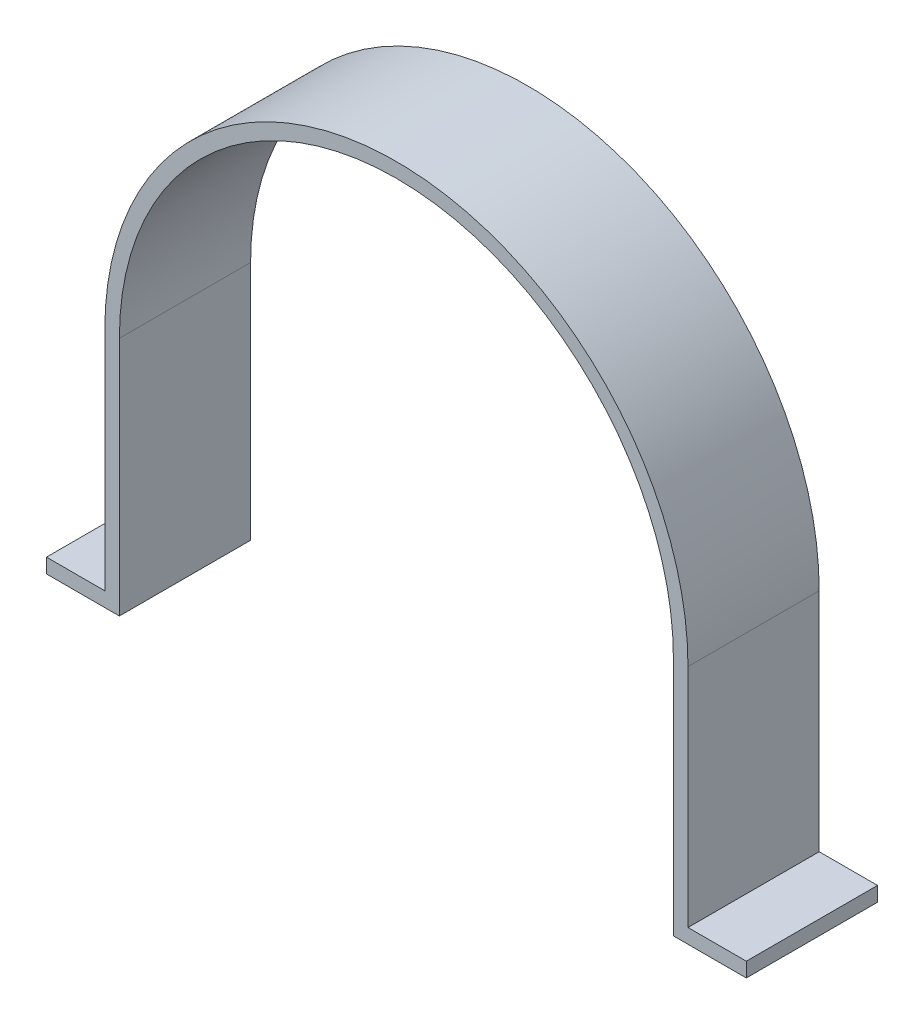
ISO-10303-21;
HEADER;
FILE_DESCRIPTION(('STEP AP214'),'2;1');
FILE_NAME('part.step','',(''),(''),'','','');
FILE_SCHEMA(('AUTOMOTIVE_DESIGN { 1 0 10303 214 1 1 1 1 }'));
ENDSEC;
DATA;
#1=APPLICATION_CONTEXT('core data for automotive mechanical design processes');
#2=APPLICATION_PROTOCOL_DEFINITION('international standard','automotive_design',2000,#1);
#3=PRODUCT_CONTEXT('',#1,'mechanical');
#4=PRODUCT('Part','Part','',(#3));
#5=PRODUCT_RELATED_PRODUCT_CATEGORY('part','',(#4));
#6=PRODUCT_DEFINITION_FORMATION('','',#4);
#7=PRODUCT_DEFINITION_CONTEXT('part definition',#1,'design');
#8=PRODUCT_DEFINITION('design','',#6,#7);
#9=PRODUCT_DEFINITION_SHAPE('','',#8);
#10=(LENGTH_UNIT() NAMED_UNIT(*) SI_UNIT(.MILLI.,.METRE.));
#11=(NAMED_UNIT(*) PLANE_ANGLE_UNIT() SI_UNIT($,.RADIAN.));
#12=(NAMED_UNIT(*) SI_UNIT($,.STERADIAN.) SOLID_ANGLE_UNIT());
#13=UNCERTAINTY_MEASURE_WITH_UNIT(LENGTH_MEASURE(1.E-05),#10,'distance_accuracy_value','');
#14=(GEOMETRIC_REPRESENTATION_CONTEXT(3) GLOBAL_UNCERTAINTY_ASSIGNED_CONTEXT((#13)) GLOBAL_UNIT_ASSIGNED_CONTEXT((#10,
#11,#12)) REPRESENTATION_CONTEXT('',''));
#15=CARTESIAN_POINT('',(0.,0.,0.));
#16=DIRECTION('',(0.,0.,1.));
#17=DIRECTION('',(1.,0.,0.));
#18=AXIS2_PLACEMENT_3D('',#15,#16,#17);
#19=CARTESIAN_POINT('',(0.,28.5,9.));
#20=DIRECTION('',(0.,0.,-1.));
#21=DIRECTION('',(-1.,0.,0.));
#22=AXIS2_PLACEMENT_3D('',#19,#20,#21);
#23=CYLINDRICAL_SURFACE('',#22,19.);
#24=CARTESIAN_POINT('',(0.,28.5,0.));
#25=DIRECTION('',(0.,0.,-1.));
#26=DIRECTION('',(-1.,0.,0.));
#27=AXIS2_PLACEMENT_3D('',#24,#25,#26);
#28=CIRCLE('',#27,19.);
#29=CARTESIAN_POINT('',(-19.,28.5,0.));
#30=VERTEX_POINT('',#29);
#31=CARTESIAN_POINT('',(19.,28.5,0.));
#32=VERTEX_POINT('',#31);
#33=EDGE_CURVE('E172',#30,#32,#28,.T.);
#34=ORIENTED_EDGE('',*,*,#33,.T.);
#35=DIRECTION('',(0.,0.,-1.));
#36=VECTOR('',#35,1.);
#37=CARTESIAN_POINT('',(19.,28.5,9.));
#38=LINE('',#37,#36);
#39=CARTESIAN_POINT('',(19.,28.5,9.));
#40=VERTEX_POINT('',#39);
#41=EDGE_CURVE('E11',#40,#32,#38,.T.);
#42=ORIENTED_EDGE('',*,*,#41,.F.);
#43=CARTESIAN_POINT('',(0.,28.5,9.));
#44=DIRECTION('',(0.,0.,-1.));
#45=DIRECTION('',(-1.,0.,0.));
#46=AXIS2_PLACEMENT_3D('',#43,#44,#45);
#47=CIRCLE('',#46,19.);
#48=CARTESIAN_POINT('',(-19.,28.5,9.));
#49=VERTEX_POINT('',#48);
#50=EDGE_CURVE('E206',#49,#40,#47,.T.);
#51=ORIENTED_EDGE('',*,*,#50,.F.);
#52=DIRECTION('',(0.,0.,-1.));
#53=VECTOR('',#52,1.);
#54=CARTESIAN_POINT('',(-19.,28.5,9.));
#55=LINE('',#54,#53);
#56=EDGE_CURVE('E168',#49,#30,#55,.T.);
#57=ORIENTED_EDGE('',*,*,#56,.T.);
#58=EDGE_LOOP('',(#34,#42,#51,#57));
#59=FACE_BOUND('',#58,.T.);
#60=ADVANCED_FACE('F45',(#59),#23,.F.);
#61=CARTESIAN_POINT('',(19.,28.5,9.));
#62=DIRECTION('',(1.,0.,0.));
#63=DIRECTION('',(0.,0.,-1.));
#64=AXIS2_PLACEMENT_3D('',#61,#62,#63);
#65=PLANE('',#64);
#66=DIRECTION('',(0.,-1.,0.));
#67=VECTOR('',#66,1.);
#68=CARTESIAN_POINT('',(19.,28.5,0.));
#69=LINE('',#68,#67);
#70=CARTESIAN_POINT('',(19.,12.,0.));
#71=VERTEX_POINT('',#70);
#72=EDGE_CURVE('E176',#32,#71,#69,.T.);
#73=ORIENTED_EDGE('',*,*,#72,.T.);
#74=DIRECTION('',(0.,0.,-1.));
#75=VECTOR('',#74,1.);
#76=CARTESIAN_POINT('',(19.,12.,9.));
#77=LINE('',#76,#75);
#78=CARTESIAN_POINT('',(19.,12.,9.));
#79=VERTEX_POINT('',#78);
#80=EDGE_CURVE('E54',#79,#71,#77,.T.);
#81=ORIENTED_EDGE('',*,*,#80,.F.);
#82=DIRECTION('',(0.,-1.,0.));
#83=VECTOR('',#82,1.);
#84=CARTESIAN_POINT('',(19.,28.5,9.));
#85=LINE('',#84,#83);
#86=EDGE_CURVE('E117',#40,#79,#85,.T.);
#87=ORIENTED_EDGE('',*,*,#86,.F.);
#88=ORIENTED_EDGE('',*,*,#41,.T.);
#89=EDGE_LOOP('',(#73,#81,#87,#88));
#90=FACE_BOUND('',#89,.T.);
#91=ADVANCED_FACE('F282',(#90),#65,.F.);
#92=CARTESIAN_POINT('',(19.,12.,9.));
#93=DIRECTION('',(0.,1.,0.));
#94=DIRECTION('',(0.,0.,1.));
#95=AXIS2_PLACEMENT_3D('',#92,#93,#94);
#96=PLANE('',#95);
#97=DIRECTION('',(1.,0.,0.));
#98=VECTOR('',#97,1.);
#99=CARTESIAN_POINT('',(19.,12.,0.));
#100=LINE('',#99,#98);
#101=CARTESIAN_POINT('',(24.,12.,0.));
#102=VERTEX_POINT('',#101);
#103=EDGE_CURVE('E179',#71,#102,#100,.T.);
#104=ORIENTED_EDGE('',*,*,#103,.T.);
#105=DIRECTION('',(0.,0.,-1.));
#106=VECTOR('',#105,1.);
#107=CARTESIAN_POINT('',(24.,12.,9.));
#108=LINE('',#107,#106);
#109=CARTESIAN_POINT('',(24.,12.,9.));
#110=VERTEX_POINT('',#109);
#111=EDGE_CURVE('E232',#110,#102,#108,.T.);
#112=ORIENTED_EDGE('',*,*,#111,.F.);
#113=DIRECTION('',(1.,0.,0.));
#114=VECTOR('',#113,1.);
#115=CARTESIAN_POINT('',(19.,12.,9.));
#116=LINE('',#115,#114);
#117=EDGE_CURVE('E242',#79,#110,#116,.T.);
#118=ORIENTED_EDGE('',*,*,#117,.F.);
#119=ORIENTED_EDGE('',*,*,#80,.T.);
#120=EDGE_LOOP('',(#104,#112,#118,#119));
#121=FACE_BOUND('',#120,.T.);
#122=ADVANCED_FACE('F240',(#121),#96,.F.);
#123=CARTESIAN_POINT('',(24.,12.,9.));
#124=DIRECTION('',(-1.,0.,0.));
#125=DIRECTION('',(0.,0.,1.));
#126=AXIS2_PLACEMENT_3D('',#123,#124,#125);
#127=PLANE('',#126);
#128=DIRECTION('',(0.,1.,0.));
#129=VECTOR('',#128,1.);
#130=CARTESIAN_POINT('',(24.,12.,0.));
#131=LINE('',#130,#129);
#132=CARTESIAN_POINT('',(24.,13.,0.));
#133=VERTEX_POINT('',#132);
#134=EDGE_CURVE('E182',#102,#133,#131,.T.);
#135=ORIENTED_EDGE('',*,*,#134,.T.);
#136=DIRECTION('',(0.,0.,-1.));
#137=VECTOR('',#136,1.);
#138=CARTESIAN_POINT('',(24.,13.,9.));
#139=LINE('',#138,#137);
#140=CARTESIAN_POINT('',(24.,13.,9.));
#141=VERTEX_POINT('',#140);
#142=EDGE_CURVE('E228',#141,#133,#139,.T.);
#143=ORIENTED_EDGE('',*,*,#142,.F.);
#144=DIRECTION('',(0.,1.,0.));
#145=VECTOR('',#144,1.);
#146=CARTESIAN_POINT('',(24.,12.,9.));
#147=LINE('',#146,#145);
#148=EDGE_CURVE('E261',#110,#141,#147,.T.);
#149=ORIENTED_EDGE('',*,*,#148,.F.);
#150=ORIENTED_EDGE('',*,*,#111,.T.);
#151=EDGE_LOOP('',(#135,#143,#149,#150));
#152=FACE_BOUND('',#151,.T.);
#153=ADVANCED_FACE('F251',(#152),#127,.F.);
#154=CARTESIAN_POINT('',(24.,13.,9.));
#155=DIRECTION('',(0.,-1.,0.));
#156=DIRECTION('',(0.,0.,-1.));
#157=AXIS2_PLACEMENT_3D('',#154,#155,#156);
#158=PLANE('',#157);
#159=DIRECTION('',(-1.,0.,0.));
#160=VECTOR('',#159,1.);
#161=CARTESIAN_POINT('',(24.,13.,0.));
#162=LINE('',#161,#160);
#163=CARTESIAN_POINT('',(20.,13.,0.));
#164=VERTEX_POINT('',#163);
#165=EDGE_CURVE('E185',#133,#164,#162,.T.);
#166=ORIENTED_EDGE('',*,*,#165,.T.);
#167=DIRECTION('',(0.,0.,-1.));
#168=VECTOR('',#167,1.);
#169=CARTESIAN_POINT('',(20.,13.,9.));
#170=LINE('',#169,#168);
#171=CARTESIAN_POINT('',(20.,13.,9.));
#172=VERTEX_POINT('',#171);
#173=EDGE_CURVE('E225',#172,#164,#170,.T.);
#174=ORIENTED_EDGE('',*,*,#173,.F.);
#175=DIRECTION('',(-1.,0.,0.));
#176=VECTOR('',#175,1.);
#177=CARTESIAN_POINT('',(24.,13.,9.));
#178=LINE('',#177,#176);
#179=EDGE_CURVE('E257',#141,#172,#178,.T.);
#180=ORIENTED_EDGE('',*,*,#179,.F.);
#181=ORIENTED_EDGE('',*,*,#142,.T.);
#182=EDGE_LOOP('',(#166,#174,#180,#181));
#183=FACE_BOUND('',#182,.T.);
#184=ADVANCED_FACE('F255',(#183),#158,.F.);
#185=CARTESIAN_POINT('',(20.,13.,9.));
#186=DIRECTION('',(-1.,0.,0.));
#187=DIRECTION('',(0.,0.,1.));
#188=AXIS2_PLACEMENT_3D('',#185,#186,#187);
#189=PLANE('',#188);
#190=DIRECTION('',(0.,1.,0.));
#191=VECTOR('',#190,1.);
#192=CARTESIAN_POINT('',(20.,13.,0.));
#193=LINE('',#192,#191);
#194=CARTESIAN_POINT('',(20.,28.5,0.));
#195=VERTEX_POINT('',#194);
#196=EDGE_CURVE('E188',#164,#195,#193,.T.);
#197=ORIENTED_EDGE('',*,*,#196,.T.);
#198=DIRECTION('',(0.,0.,-1.));
#199=VECTOR('',#198,1.);
#200=CARTESIAN_POINT('',(20.,28.5,9.));
#201=LINE('',#200,#199);
#202=CARTESIAN_POINT('',(20.,28.5,9.));
#203=VERTEX_POINT('',#202);
#204=EDGE_CURVE('E221',#203,#195,#201,.T.);
#205=ORIENTED_EDGE('',*,*,#204,.F.);
#206=DIRECTION('',(0.,1.,0.));
#207=VECTOR('',#206,1.);
#208=CARTESIAN_POINT('',(20.,13.,9.));
#209=LINE('',#208,#207);
#210=EDGE_CURVE('E260',#172,#203,#209,.T.);
#211=ORIENTED_EDGE('',*,*,#210,.F.);
#212=ORIENTED_EDGE('',*,*,#173,.T.);
#213=EDGE_LOOP('',(#197,#205,#211,#212));
#214=FACE_BOUND('',#213,.T.);
#215=ADVANCED_FACE('F293',(#214),#189,.F.);
#216=CARTESIAN_POINT('',(0.,28.5,9.));
#217=DIRECTION('',(0.,0.,-1.));
#218=DIRECTION('',(-1.,0.,0.));
#219=AXIS2_PLACEMENT_3D('',#216,#217,#218);
#220=CYLINDRICAL_SURFACE('',#219,20.);
#221=CARTESIAN_POINT('',(0.,28.5,0.));
#222=DIRECTION('',(0.,0.,1.));
#223=DIRECTION('',(1.,0.,0.));
#224=AXIS2_PLACEMENT_3D('',#221,#222,#223);
#225=CIRCLE('',#224,20.);
#226=CARTESIAN_POINT('',(-20.,28.5,0.));
#227=VERTEX_POINT('',#226);
#228=EDGE_CURVE('E191',#195,#227,#225,.T.);
#229=ORIENTED_EDGE('',*,*,#228,.T.);
#230=DIRECTION('',(0.,0.,-1.));
#231=VECTOR('',#230,1.);
#232=CARTESIAN_POINT('',(-20.,28.5,9.));
#233=LINE('',#232,#231);
#234=CARTESIAN_POINT('',(-20.,28.5,9.));
#235=VERTEX_POINT('',#234);
#236=EDGE_CURVE('E217',#235,#227,#233,.T.);
#237=ORIENTED_EDGE('',*,*,#236,.F.);
#238=CARTESIAN_POINT('',(0.,28.5,9.));
#239=DIRECTION('',(0.,0.,1.));
#240=DIRECTION('',(1.,0.,0.));
#241=AXIS2_PLACEMENT_3D('',#238,#239,#240);
#242=CIRCLE('',#241,20.);
#243=EDGE_CURVE('E264',#203,#235,#242,.T.);
#244=ORIENTED_EDGE('',*,*,#243,.F.);
#245=ORIENTED_EDGE('',*,*,#204,.T.);
#246=EDGE_LOOP('',(#229,#237,#244,#245));
#247=FACE_BOUND('',#246,.T.);
#248=ADVANCED_FACE('F296',(#247),#220,.T.);
#249=CARTESIAN_POINT('',(-20.,28.5,9.));
#250=DIRECTION('',(1.,0.,0.));
#251=DIRECTION('',(0.,0.,-1.));
#252=AXIS2_PLACEMENT_3D('',#249,#250,#251);
#253=PLANE('',#252);
#254=DIRECTION('',(0.,-1.,0.));
#255=VECTOR('',#254,1.);
#256=CARTESIAN_POINT('',(-20.,28.5,0.));
#257=LINE('',#256,#255);
#258=CARTESIAN_POINT('',(-20.,13.,0.));
#259=VERTEX_POINT('',#258);
#260=EDGE_CURVE('E194',#227,#259,#257,.T.);
#261=ORIENTED_EDGE('',*,*,#260,.T.);
#262=DIRECTION('',(0.,0.,-1.));
#263=VECTOR('',#262,1.);
#264=CARTESIAN_POINT('',(-20.,13.,9.));
#265=LINE('',#264,#263);
#266=CARTESIAN_POINT('',(-20.,13.,9.));
#267=VERTEX_POINT('',#266);
#268=EDGE_CURVE('E213',#267,#259,#265,.T.);
#269=ORIENTED_EDGE('',*,*,#268,.F.);
#270=DIRECTION('',(0.,-1.,0.));
#271=VECTOR('',#270,1.);
#272=CARTESIAN_POINT('',(-20.,28.5,9.));
#273=LINE('',#272,#271);
#274=EDGE_CURVE('E272',#235,#267,#273,.T.);
#275=ORIENTED_EDGE('',*,*,#274,.F.);
#276=ORIENTED_EDGE('',*,*,#236,.T.);
#277=EDGE_LOOP('',(#261,#269,#275,#276));
#278=FACE_BOUND('',#277,.T.);
#279=ADVANCED_FACE('F300',(#278),#253,.F.);
#280=CARTESIAN_POINT('',(-20.,13.,9.));
#281=DIRECTION('',(0.,-1.,0.));
#282=DIRECTION('',(0.,0.,-1.));
#283=AXIS2_PLACEMENT_3D('',#280,#281,#282);
#284=PLANE('',#283);
#285=DIRECTION('',(-1.,0.,0.));
#286=VECTOR('',#285,1.);
#287=CARTESIAN_POINT('',(-20.,13.,0.));
#288=LINE('',#287,#286);
#289=CARTESIAN_POINT('',(-24.,13.,0.));
#290=VERTEX_POINT('',#289);
#291=EDGE_CURVE('E197',#259,#290,#288,.T.);
#292=ORIENTED_EDGE('',*,*,#291,.T.);
#293=DIRECTION('',(0.,0.,-1.));
#294=VECTOR('',#293,1.);
#295=CARTESIAN_POINT('',(-24.,13.,9.));
#296=LINE('',#295,#294);
#297=CARTESIAN_POINT('',(-24.,13.,9.));
#298=VERTEX_POINT('',#297);
#299=EDGE_CURVE('E159',#298,#290,#296,.T.);
#300=ORIENTED_EDGE('',*,*,#299,.F.);
#301=DIRECTION('',(-1.,0.,0.));
#302=VECTOR('',#301,1.);
#303=CARTESIAN_POINT('',(-20.,13.,9.));
#304=LINE('',#303,#302);
#305=EDGE_CURVE('E148',#267,#298,#304,.T.);
#306=ORIENTED_EDGE('',*,*,#305,.F.);
#307=ORIENTED_EDGE('',*,*,#268,.T.);
#308=EDGE_LOOP('',(#292,#300,#306,#307));
#309=FACE_BOUND('',#308,.T.);
#310=ADVANCED_FACE('F304',(#309),#284,.F.);
#311=CARTESIAN_POINT('',(-24.,13.,9.));
#312=DIRECTION('',(1.,0.,0.));
#313=DIRECTION('',(0.,0.,-1.));
#314=AXIS2_PLACEMENT_3D('',#311,#312,#313);
#315=PLANE('',#314);
#316=DIRECTION('',(0.,-1.,0.));
#317=VECTOR('',#316,1.);
#318=CARTESIAN_POINT('',(-24.,13.,0.));
#319=LINE('',#318,#317);
#320=CARTESIAN_POINT('',(-24.,12.,0.));
#321=VERTEX_POINT('',#320);
#322=EDGE_CURVE('E157',#290,#321,#319,.T.);
#323=ORIENTED_EDGE('',*,*,#322,.T.);
#324=DIRECTION('',(0.,0.,-1.));
#325=VECTOR('',#324,1.);
#326=CARTESIAN_POINT('',(-24.,12.,9.));
#327=LINE('',#326,#325);
#328=CARTESIAN_POINT('',(-24.,12.,9.));
#329=VERTEX_POINT('',#328);
#330=EDGE_CURVE('E154',#329,#321,#327,.T.);
#331=ORIENTED_EDGE('',*,*,#330,.F.);
#332=DIRECTION('',(0.,-1.,0.));
#333=VECTOR('',#332,1.);
#334=CARTESIAN_POINT('',(-24.,13.,9.));
#335=LINE('',#334,#333);
#336=EDGE_CURVE('E142',#298,#329,#335,.T.);
#337=ORIENTED_EDGE('',*,*,#336,.F.);
#338=ORIENTED_EDGE('',*,*,#299,.T.);
#339=EDGE_LOOP('',(#323,#331,#337,#338));
#340=FACE_BOUND('',#339,.T.);
#341=ADVANCED_FACE('F155',(#340),#315,.F.);
#342=CARTESIAN_POINT('',(-24.,12.,9.));
#343=DIRECTION('',(0.,1.,0.));
#344=DIRECTION('',(0.,0.,1.));
#345=AXIS2_PLACEMENT_3D('',#342,#343,#344);
#346=PLANE('',#345);
#347=DIRECTION('',(1.,0.,0.));
#348=VECTOR('',#347,1.);
#349=CARTESIAN_POINT('',(-24.,12.,0.));
#350=LINE('',#349,#348);
#351=CARTESIAN_POINT('',(-19.,12.,0.));
#352=VERTEX_POINT('',#351);
#353=EDGE_CURVE('E103',#321,#352,#350,.T.);
#354=ORIENTED_EDGE('',*,*,#353,.T.);
#355=DIRECTION('',(0.,0.,-1.));
#356=VECTOR('',#355,1.);
#357=CARTESIAN_POINT('',(-19.,12.,9.));
#358=LINE('',#357,#356);
#359=CARTESIAN_POINT('',(-19.,12.,9.));
#360=VERTEX_POINT('',#359);
#361=EDGE_CURVE('E160',#360,#352,#358,.T.);
#362=ORIENTED_EDGE('',*,*,#361,.F.);
#363=DIRECTION('',(1.,0.,0.));
#364=VECTOR('',#363,1.);
#365=CARTESIAN_POINT('',(-24.,12.,9.));
#366=LINE('',#365,#364);
#367=EDGE_CURVE('E146',#329,#360,#366,.T.);
#368=ORIENTED_EDGE('',*,*,#367,.F.);
#369=ORIENTED_EDGE('',*,*,#330,.T.);
#370=EDGE_LOOP('',(#354,#362,#368,#369));
#371=FACE_BOUND('',#370,.T.);
#372=ADVANCED_FACE('F162',(#371),#346,.F.);
#373=CARTESIAN_POINT('',(-19.,12.,9.));
#374=DIRECTION('',(-1.,0.,0.));
#375=DIRECTION('',(0.,0.,1.));
#376=AXIS2_PLACEMENT_3D('',#373,#374,#375);
#377=PLANE('',#376);
#378=DIRECTION('',(0.,1.,0.));
#379=VECTOR('',#378,1.);
#380=CARTESIAN_POINT('',(-19.,12.,0.));
#381=LINE('',#380,#379);
#382=EDGE_CURVE('E109',#352,#30,#381,.T.);
#383=ORIENTED_EDGE('',*,*,#382,.T.);
#384=ORIENTED_EDGE('',*,*,#56,.F.);
#385=DIRECTION('',(0.,1.,0.));
#386=VECTOR('',#385,1.);
#387=CARTESIAN_POINT('',(-19.,12.,9.));
#388=LINE('',#387,#386);
#389=EDGE_CURVE('E62',#360,#49,#388,.T.);
#390=ORIENTED_EDGE('',*,*,#389,.F.);
#391=ORIENTED_EDGE('',*,*,#361,.T.);
#392=EDGE_LOOP('',(#383,#384,#390,#391));
#393=FACE_BOUND('',#392,.T.);
#394=ADVANCED_FACE('F313',(#393),#377,.F.);
#395=CARTESIAN_POINT('',(0.,28.5,9.));
#396=DIRECTION('',(0.,0.,-1.));
#397=DIRECTION('',(-1.,0.,0.));
#398=AXIS2_PLACEMENT_3D('',#395,#396,#397);
#399=PLANE('',#398);
#400=ORIENTED_EDGE('',*,*,#50,.T.);
#401=ORIENTED_EDGE('',*,*,#86,.T.);
#402=ORIENTED_EDGE('',*,*,#117,.T.);
#403=ORIENTED_EDGE('',*,*,#148,.T.);
#404=ORIENTED_EDGE('',*,*,#179,.T.);
#405=ORIENTED_EDGE('',*,*,#210,.T.);
#406=ORIENTED_EDGE('',*,*,#243,.T.);
#407=ORIENTED_EDGE('',*,*,#274,.T.);
#408=ORIENTED_EDGE('',*,*,#305,.T.);
#409=ORIENTED_EDGE('',*,*,#336,.T.);
#410=ORIENTED_EDGE('',*,*,#367,.T.);
#411=ORIENTED_EDGE('',*,*,#389,.T.);
#412=EDGE_LOOP('',(#400,#401,#402,#403,#404,#405,#406,#407,#408,#409,#410,#411));
#413=FACE_BOUND('',#412,.T.);
#414=ADVANCED_FACE('F144',(#413),#399,.F.);
#415=CARTESIAN_POINT('',(0.,28.5,0.));
#416=DIRECTION('',(0.,0.,-1.));
#417=DIRECTION('',(-1.,0.,0.));
#418=AXIS2_PLACEMENT_3D('',#415,#416,#417);
#419=PLANE('',#418);
#420=ORIENTED_EDGE('',*,*,#33,.F.);
#421=ORIENTED_EDGE('',*,*,#382,.F.);
#422=ORIENTED_EDGE('',*,*,#353,.F.);
#423=ORIENTED_EDGE('',*,*,#322,.F.);
#424=ORIENTED_EDGE('',*,*,#291,.F.);
#425=ORIENTED_EDGE('',*,*,#260,.F.);
#426=ORIENTED_EDGE('',*,*,#228,.F.);
#427=ORIENTED_EDGE('',*,*,#196,.F.);
#428=ORIENTED_EDGE('',*,*,#165,.F.);
#429=ORIENTED_EDGE('',*,*,#134,.F.);
#430=ORIENTED_EDGE('',*,*,#103,.F.);
#431=ORIENTED_EDGE('',*,*,#72,.F.);
#432=EDGE_LOOP('',(#420,#421,#422,#423,#424,#425,#426,#427,#428,#429,#430,#431));
#433=FACE_BOUND('',#432,.T.);
#434=ADVANCED_FACE('F246',(#433),#419,.T.);
#435=CLOSED_SHELL('',(#60,#91,#122,#153,#184,#215,#248,#279,#310,#341,#372,#394,#414,#434));
#436=MANIFOLD_SOLID_BREP('B2',#435);
#437=ADVANCED_BREP_SHAPE_REPRESENTATION('',(#18,#436),#14);
#438=SHAPE_DEFINITION_REPRESENTATION(#9,#437);
ENDSEC;
END-ISO-10303-21;
